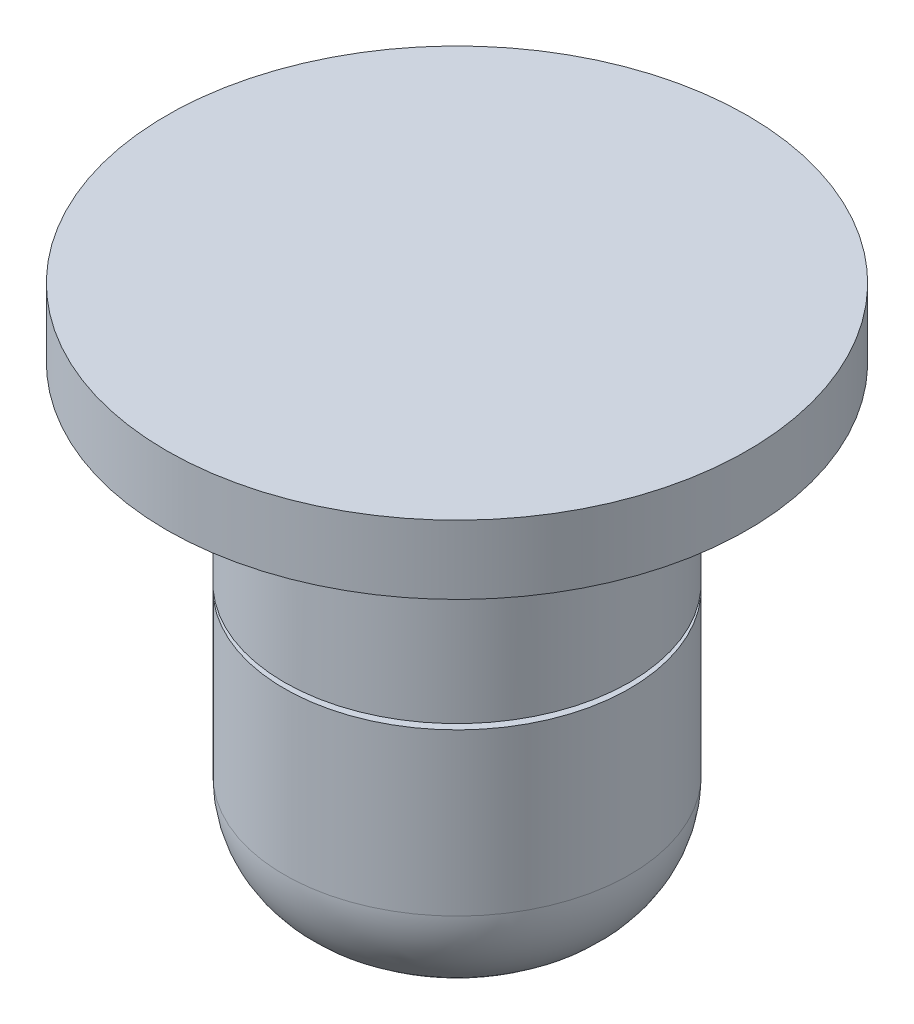
ISO-10303-21;
HEADER;
FILE_DESCRIPTION(('STEP AP214'),'2;1');
FILE_NAME('part.step','',(''),(''),'','','');
FILE_SCHEMA(('AUTOMOTIVE_DESIGN { 1 0 10303 214 1 1 1 1 }'));
ENDSEC;
DATA;
#1=APPLICATION_CONTEXT('core data for automotive mechanical design processes');
#2=APPLICATION_PROTOCOL_DEFINITION('international standard','automotive_design',2000,#1);
#3=PRODUCT_CONTEXT('',#1,'mechanical');
#4=PRODUCT('Part','Part','',(#3));
#5=PRODUCT_RELATED_PRODUCT_CATEGORY('part','',(#4));
#6=PRODUCT_DEFINITION_FORMATION('','',#4);
#7=PRODUCT_DEFINITION_CONTEXT('part definition',#1,'design');
#8=PRODUCT_DEFINITION('design','',#6,#7);
#9=PRODUCT_DEFINITION_SHAPE('','',#8);
#10=(LENGTH_UNIT() NAMED_UNIT(*) SI_UNIT(.MILLI.,.METRE.));
#11=(NAMED_UNIT(*) PLANE_ANGLE_UNIT() SI_UNIT($,.RADIAN.));
#12=(NAMED_UNIT(*) SI_UNIT($,.STERADIAN.) SOLID_ANGLE_UNIT());
#13=UNCERTAINTY_MEASURE_WITH_UNIT(LENGTH_MEASURE(1.E-05),#10,'distance_accuracy_value','');
#14=(GEOMETRIC_REPRESENTATION_CONTEXT(3) GLOBAL_UNCERTAINTY_ASSIGNED_CONTEXT((#13)) GLOBAL_UNIT_ASSIGNED_CONTEXT((#10,
#11,#12)) REPRESENTATION_CONTEXT('',''));
#15=CARTESIAN_POINT('',(0.,0.,0.));
#16=DIRECTION('',(0.,0.,1.));
#17=DIRECTION('',(1.,0.,0.));
#18=AXIS2_PLACEMENT_3D('',#15,#16,#17);
#19=CARTESIAN_POINT('',(0.,-9.74092859448206,0.));
#20=DIRECTION('',(0.,-1.,0.));
#21=DIRECTION('',(0.,0.,-1.));
#22=AXIS2_PLACEMENT_3D('',#19,#20,#21);
#23=CYLINDRICAL_SURFACE('',#22,6.35);
#24=CARTESIAN_POINT('',(0.,0.200000000000001,0.));
#25=DIRECTION('',(0.,1.,0.));
#26=DIRECTION('',(0.,0.,1.));
#27=AXIS2_PLACEMENT_3D('',#24,#25,#26);
#28=CIRCLE('',#27,6.35);
#29=CARTESIAN_POINT('',(0.,0.200000000000001,6.35));
#30=VERTEX_POINT('',#29);
#31=EDGE_CURVE('E11',#30,#30,#28,.F.);
#32=ORIENTED_EDGE('',*,*,#31,.F.);
#33=EDGE_LOOP('',(#32));
#34=FACE_BOUND('',#33,.T.);
#35=CARTESIAN_POINT('',(0.,7.21580168172409,0.));
#36=DIRECTION('',(0.,-1.,0.));
#37=DIRECTION('',(0.,0.,-1.));
#38=AXIS2_PLACEMENT_3D('',#35,#36,#37);
#39=CIRCLE('',#38,6.35);
#40=CARTESIAN_POINT('',(0.,7.21580168172409,-6.35));
#41=VERTEX_POINT('',#40);
#42=EDGE_CURVE('E43',#41,#41,#39,.T.);
#43=ORIENTED_EDGE('',*,*,#42,.T.);
#44=EDGE_LOOP('',(#43));
#45=FACE_BOUND('',#44,.T.);
#46=ADVANCED_FACE('F40',(#34,#45),#23,.T.);
#47=CARTESIAN_POINT('',(0.,9.74092859448206,0.));
#48=DIRECTION('',(0.,1.,0.));
#49=DIRECTION('',(0.,0.,1.));
#50=AXIS2_PLACEMENT_3D('',#47,#48,#49);
#51=PLANE('',#50);
#52=CARTESIAN_POINT('',(0.,9.74092859448206,0.));
#53=DIRECTION('',(0.,-1.,0.));
#54=DIRECTION('',(0.,0.,-1.));
#55=AXIS2_PLACEMENT_3D('',#52,#53,#54);
#56=CIRCLE('',#55,10.6795861505802);
#57=CARTESIAN_POINT('',(0.,9.74092859448206,-10.6795861505802));
#58=VERTEX_POINT('',#57);
#59=EDGE_CURVE('E52',#58,#58,#56,.T.);
#60=ORIENTED_EDGE('',*,*,#59,.F.);
#61=EDGE_LOOP('',(#60));
#62=FACE_BOUND('',#61,.T.);
#63=ADVANCED_FACE('F72',(#62),#51,.T.);
#64=CARTESIAN_POINT('',(0.,-9.74092859448206,0.));
#65=DIRECTION('',(0.,-1.,0.));
#66=DIRECTION('',(0.,0.,-1.));
#67=AXIS2_PLACEMENT_3D('',#64,#65,#66);
#68=CYLINDRICAL_SURFACE('',#67,10.6795861505802);
#69=ORIENTED_EDGE('',*,*,#59,.T.);
#70=EDGE_LOOP('',(#69));
#71=FACE_BOUND('',#70,.T.);
#72=CARTESIAN_POINT('',(0.,7.21580168172409,0.));
#73=DIRECTION('',(0.,-1.,0.));
#74=DIRECTION('',(0.,0.,-1.));
#75=AXIS2_PLACEMENT_3D('',#72,#73,#74);
#76=CIRCLE('',#75,10.6795861505802);
#77=CARTESIAN_POINT('',(0.,7.21580168172409,-10.6795861505802));
#78=VERTEX_POINT('',#77);
#79=EDGE_CURVE('E47',#78,#78,#76,.T.);
#80=ORIENTED_EDGE('',*,*,#79,.F.);
#81=EDGE_LOOP('',(#80));
#82=FACE_BOUND('',#81,.T.);
#83=ADVANCED_FACE('F64',(#71,#82),#68,.T.);
#84=CARTESIAN_POINT('',(10.6795861505802,7.21580168172409,0.));
#85=DIRECTION('',(0.,-1.,0.));
#86=DIRECTION('',(0.,0.,-1.));
#87=AXIS2_PLACEMENT_3D('',#84,#85,#86);
#88=PLANE('',#87);
#89=ORIENTED_EDGE('',*,*,#79,.T.);
#90=EDGE_LOOP('',(#89));
#91=FACE_BOUND('',#90,.T.);
#92=ORIENTED_EDGE('',*,*,#42,.F.);
#93=EDGE_LOOP('',(#92));
#94=FACE_BOUND('',#93,.T.);
#95=ADVANCED_FACE('F61',(#91,#94),#88,.T.);
#96=CARTESIAN_POINT('',(-36.4156280190855,0.200000000000001,-10.6795861505802));
#97=DIRECTION('',(0.,1.,0.));
#98=DIRECTION('',(0.,0.,1.));
#99=AXIS2_PLACEMENT_3D('',#96,#97,#98);
#100=PLANE('',#99);
#101=ORIENTED_EDGE('',*,*,#31,.T.);
#102=EDGE_LOOP('',(#101));
#103=FACE_BOUND('',#102,.T.);
#104=ADVANCED_FACE('F63',(#103),#100,.F.);
#105=CLOSED_SHELL('',(#46,#63,#83,#95,#104));
#106=MANIFOLD_SOLID_BREP('B2',#105);
#107=CARTESIAN_POINT('',(2.54,-9.74092859448206,0.));
#108=DIRECTION('',(0.,-1.,0.));
#109=DIRECTION('',(0.,0.,-1.));
#110=AXIS2_PLACEMENT_3D('',#107,#108,#109);
#111=PLANE('',#110);
#112=CARTESIAN_POINT('',(0.,-9.74092859448206,0.));
#113=DIRECTION('',(0.,-1.,0.));
#114=DIRECTION('',(0.,0.,-1.));
#115=AXIS2_PLACEMENT_3D('',#112,#113,#114);
#116=CIRCLE('',#115,2.54);
#117=CARTESIAN_POINT('',(0.,-9.74092859448206,-2.54));
#118=VERTEX_POINT('',#117);
#119=EDGE_CURVE('E118',#118,#118,#116,.T.);
#120=ORIENTED_EDGE('',*,*,#119,.T.);
#121=EDGE_LOOP('',(#120));
#122=FACE_BOUND('',#121,.T.);
#123=ADVANCED_FACE('F110',(#122),#111,.T.);
#124=CARTESIAN_POINT('',(0.,-5.93092859448206,0.));
#125=DIRECTION('',(0.,-1.,0.));
#126=DIRECTION('',(0.,0.,-1.));
#127=AXIS2_PLACEMENT_3D('',#124,#125,#126);
#128=DEGENERATE_TOROIDAL_SURFACE('',#127,2.54,3.81,.T.);
#129=CARTESIAN_POINT('',(0.,-5.93092859448206,0.));
#130=DIRECTION('',(0.,-1.,0.));
#131=DIRECTION('',(0.,0.,-1.));
#132=AXIS2_PLACEMENT_3D('',#129,#130,#131);
#133=CIRCLE('',#132,6.35);
#134=CARTESIAN_POINT('',(0.,-5.93092859448206,-6.35));
#135=VERTEX_POINT('',#134);
#136=EDGE_CURVE('E39',#135,#135,#133,.T.);
#137=ORIENTED_EDGE('',*,*,#136,.T.);
#138=EDGE_LOOP('',(#137));
#139=FACE_BOUND('',#138,.T.);
#140=ORIENTED_EDGE('',*,*,#119,.F.);
#141=EDGE_LOOP('',(#140));
#142=FACE_BOUND('',#141,.T.);
#143=ADVANCED_FACE('F132',(#139,#142),#128,.T.);
#144=CARTESIAN_POINT('',(0.,-9.74092859448206,0.));
#145=DIRECTION('',(0.,-1.,0.));
#146=DIRECTION('',(0.,0.,-1.));
#147=AXIS2_PLACEMENT_3D('',#144,#145,#146);
#148=CYLINDRICAL_SURFACE('',#147,6.35);
#149=CARTESIAN_POINT('',(0.,0.,0.));
#150=DIRECTION('',(0.,-1.,0.));
#151=DIRECTION('',(0.,0.,-1.));
#152=AXIS2_PLACEMENT_3D('',#149,#150,#151);
#153=CIRCLE('',#152,6.35);
#154=CARTESIAN_POINT('',(0.,0.,-6.35));
#155=VERTEX_POINT('',#154);
#156=EDGE_CURVE('E114',#155,#155,#153,.F.);
#157=ORIENTED_EDGE('',*,*,#156,.F.);
#158=EDGE_LOOP('',(#157));
#159=FACE_BOUND('',#158,.T.);
#160=ORIENTED_EDGE('',*,*,#136,.F.);
#161=EDGE_LOOP('',(#160));
#162=FACE_BOUND('',#161,.T.);
#163=ADVANCED_FACE('F112',(#159,#162),#148,.T.);
#164=CARTESIAN_POINT('',(-36.4156280190855,0.,-10.6795861505802));
#165=DIRECTION('',(0.,-1.,0.));
#166=DIRECTION('',(0.,0.,-1.));
#167=AXIS2_PLACEMENT_3D('',#164,#165,#166);
#168=PLANE('',#167);
#169=ORIENTED_EDGE('',*,*,#156,.T.);
#170=EDGE_LOOP('',(#169));
#171=FACE_BOUND('',#170,.T.);
#172=ADVANCED_FACE('F128',(#171),#168,.F.);
#173=CLOSED_SHELL('',(#123,#143,#163,#172));
#174=MANIFOLD_SOLID_BREP('B6',#173);
#175=ADVANCED_BREP_SHAPE_REPRESENTATION('',(#18,#106,#174),#14);
#176=SHAPE_DEFINITION_REPRESENTATION(#9,#175);
ENDSEC;
END-ISO-10303-21;
